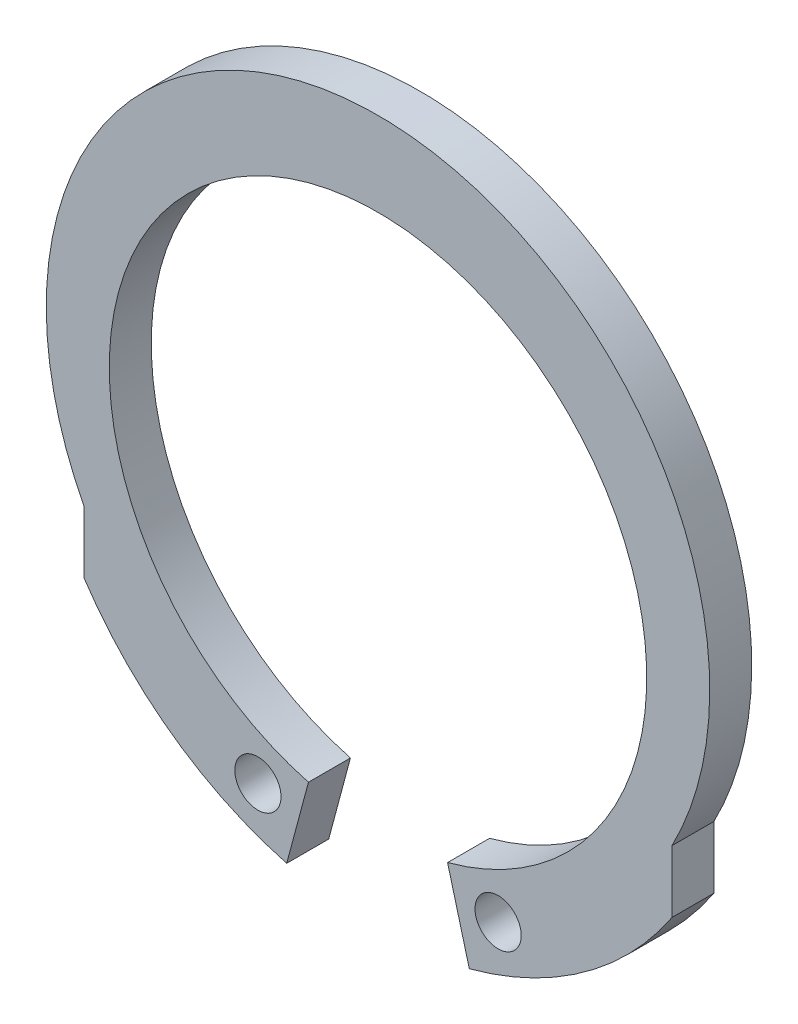
ISO-10303-21;
HEADER;
FILE_DESCRIPTION(('STEP AP214'),'2;1');
FILE_NAME('part.step','',(''),(''),'','','');
FILE_SCHEMA(('AUTOMOTIVE_DESIGN { 1 0 10303 214 1 1 1 1 }'));
ENDSEC;
DATA;
#1=APPLICATION_CONTEXT('core data for automotive mechanical design processes');
#2=APPLICATION_PROTOCOL_DEFINITION('international standard','automotive_design',2000,#1);
#3=PRODUCT_CONTEXT('',#1,'mechanical');
#4=PRODUCT('Part','Part','',(#3));
#5=PRODUCT_RELATED_PRODUCT_CATEGORY('part','',(#4));
#6=PRODUCT_DEFINITION_FORMATION('','',#4);
#7=PRODUCT_DEFINITION_CONTEXT('part definition',#1,'design');
#8=PRODUCT_DEFINITION('design','',#6,#7);
#9=PRODUCT_DEFINITION_SHAPE('','',#8);
#10=(LENGTH_UNIT() NAMED_UNIT(*) SI_UNIT(.MILLI.,.METRE.));
#11=(NAMED_UNIT(*) PLANE_ANGLE_UNIT() SI_UNIT($,.RADIAN.));
#12=(NAMED_UNIT(*) SI_UNIT($,.STERADIAN.) SOLID_ANGLE_UNIT());
#13=UNCERTAINTY_MEASURE_WITH_UNIT(LENGTH_MEASURE(1.E-05),#10,'distance_accuracy_value','');
#14=(GEOMETRIC_REPRESENTATION_CONTEXT(3) GLOBAL_UNCERTAINTY_ASSIGNED_CONTEXT((#13)) GLOBAL_UNIT_ASSIGNED_CONTEXT((#10,
#11,#12)) REPRESENTATION_CONTEXT('',''));
#15=CARTESIAN_POINT('',(0.,0.,0.));
#16=DIRECTION('',(0.,0.,1.));
#17=DIRECTION('',(1.,0.,0.));
#18=AXIS2_PLACEMENT_3D('',#15,#16,#17);
#19=CARTESIAN_POINT('',(0.,0.,1.));
#20=DIRECTION('',(0.,0.,1.));
#21=DIRECTION('',(1.,0.,0.));
#22=AXIS2_PLACEMENT_3D('',#19,#20,#21);
#23=PLANE('',#22);
#24=CARTESIAN_POINT('',(-2.86,-6.80996200449092,1.));
#25=DIRECTION('',(0.,0.,1.));
#26=DIRECTION('',(1.,0.,0.));
#27=AXIS2_PLACEMENT_3D('',#24,#25,#26);
#28=CIRCLE('',#27,0.55);
#29=CARTESIAN_POINT('',(-2.31,-6.80996200449092,1.));
#30=VERTEX_POINT('',#29);
#31=EDGE_CURVE('E131',#30,#30,#28,.T.);
#32=ORIENTED_EDGE('',*,*,#31,.F.);
#33=EDGE_LOOP('',(#32));
#34=FACE_BOUND('',#33,.T.);
#35=CARTESIAN_POINT('',(0.,0.,1.));
#36=DIRECTION('',(0.,0.,1.));
#37=DIRECTION('',(1.,0.,0.));
#38=AXIS2_PLACEMENT_3D('',#35,#36,#37);
#39=CIRCLE('',#38,8.4);
#40=CARTESIAN_POINT('',(-7.,-4.64327470649756,1.));
#41=VERTEX_POINT('',#40);
#42=CARTESIAN_POINT('',(-2.17407997886112,-8.11377694082819,1.));
#43=VERTEX_POINT('',#42);
#44=EDGE_CURVE('E142',#41,#43,#39,.T.);
#45=ORIENTED_EDGE('',*,*,#44,.T.);
#46=DIRECTION('',(0.258819045102514,0.96592582628907,0.));
#47=VECTOR('',#46,1.);
#48=CARTESIAN_POINT('',(-2.17407997886112,-8.11377694082819,1.));
#49=LINE('',#48,#47);
#50=CARTESIAN_POINT('',(-1.65644188865609,-6.18192528825005,1.));
#51=VERTEX_POINT('',#50);
#52=EDGE_CURVE('E90',#43,#51,#49,.T.);
#53=ORIENTED_EDGE('',*,*,#52,.T.);
#54=CARTESIAN_POINT('',(0.,0.,1.));
#55=DIRECTION('',(0.,0.,-1.));
#56=DIRECTION('',(1.,0.,0.));
#57=AXIS2_PLACEMENT_3D('',#54,#55,#56);
#58=CIRCLE('',#57,6.4);
#59=CARTESIAN_POINT('',(1.65644188865614,-6.18192528825004,1.));
#60=VERTEX_POINT('',#59);
#61=EDGE_CURVE('E157',#51,#60,#58,.T.);
#62=ORIENTED_EDGE('',*,*,#61,.T.);
#63=DIRECTION('',(0.258819045102522,-0.965925826289068,0.));
#64=VECTOR('',#63,1.);
#65=CARTESIAN_POINT('',(1.65644188865614,-6.18192528825004,1.));
#66=LINE('',#65,#64);
#67=CARTESIAN_POINT('',(2.17407997886118,-8.11377694082817,1.));
#68=VERTEX_POINT('',#67);
#69=EDGE_CURVE('E170',#60,#68,#66,.T.);
#70=ORIENTED_EDGE('',*,*,#69,.T.);
#71=CARTESIAN_POINT('',(0.,0.,1.));
#72=DIRECTION('',(0.,0.,1.));
#73=DIRECTION('',(1.,0.,0.));
#74=AXIS2_PLACEMENT_3D('',#71,#72,#73);
#75=CIRCLE('',#74,8.4);
#76=CARTESIAN_POINT('',(7.,-4.64327470649756,1.));
#77=VERTEX_POINT('',#76);
#78=EDGE_CURVE('E109',#68,#77,#75,.T.);
#79=ORIENTED_EDGE('',*,*,#78,.T.);
#80=DIRECTION('',(0.,1.,0.));
#81=VECTOR('',#80,1.);
#82=CARTESIAN_POINT('',(7.,-4.64327470649756,1.));
#83=LINE('',#82,#81);
#84=CARTESIAN_POINT('',(7.,-3.16196668472011,1.));
#85=VERTEX_POINT('',#84);
#86=EDGE_CURVE('E103',#77,#85,#83,.T.);
#87=ORIENTED_EDGE('',*,*,#86,.T.);
#88=CARTESIAN_POINT('',(0.,0.5,1.));
#89=DIRECTION('',(0.,0.,1.));
#90=DIRECTION('',(1.,0.,0.));
#91=AXIS2_PLACEMENT_3D('',#88,#89,#90);
#92=CIRCLE('',#91,7.9);
#93=CARTESIAN_POINT('',(-7.,-3.16196668472011,1.));
#94=VERTEX_POINT('',#93);
#95=EDGE_CURVE('E107',#85,#94,#92,.T.);
#96=ORIENTED_EDGE('',*,*,#95,.T.);
#97=DIRECTION('',(0.,-1.,0.));
#98=VECTOR('',#97,1.);
#99=CARTESIAN_POINT('',(-7.,-4.64327470649756,1.));
#100=LINE('',#99,#98);
#101=EDGE_CURVE('E47',#94,#41,#100,.T.);
#102=ORIENTED_EDGE('',*,*,#101,.T.);
#103=EDGE_LOOP('',(#45,#53,#62,#70,#79,#87,#96,#102));
#104=FACE_BOUND('',#103,.T.);
#105=CARTESIAN_POINT('',(2.86,-6.80996200449092,1.));
#106=DIRECTION('',(0.,0.,1.));
#107=DIRECTION('',(-1.,0.,0.));
#108=AXIS2_PLACEMENT_3D('',#105,#106,#107);
#109=CIRCLE('',#108,0.55);
#110=CARTESIAN_POINT('',(2.31,-6.80996200449092,1.));
#111=VERTEX_POINT('',#110);
#112=EDGE_CURVE('E179',#111,#111,#109,.T.);
#113=ORIENTED_EDGE('',*,*,#112,.F.);
#114=EDGE_LOOP('',(#113));
#115=FACE_BOUND('',#114,.T.);
#116=ADVANCED_FACE('F30',(#34,#104,#115),#23,.T.);
#117=CARTESIAN_POINT('',(0.,0.,0.));
#118=DIRECTION('',(0.,0.,1.));
#119=DIRECTION('',(1.,0.,0.));
#120=AXIS2_PLACEMENT_3D('',#117,#118,#119);
#121=PLANE('',#120);
#122=CARTESIAN_POINT('',(-2.86,-6.80996200449092,0.));
#123=DIRECTION('',(0.,0.,1.));
#124=DIRECTION('',(1.,0.,0.));
#125=AXIS2_PLACEMENT_3D('',#122,#123,#124);
#126=CIRCLE('',#125,0.55);
#127=CARTESIAN_POINT('',(-2.31,-6.80996200449092,0.));
#128=VERTEX_POINT('',#127);
#129=EDGE_CURVE('E176',#128,#128,#126,.T.);
#130=ORIENTED_EDGE('',*,*,#129,.T.);
#131=EDGE_LOOP('',(#130));
#132=FACE_BOUND('',#131,.T.);
#133=CARTESIAN_POINT('',(0.,0.,0.));
#134=DIRECTION('',(0.,0.,1.));
#135=DIRECTION('',(1.,0.,0.));
#136=AXIS2_PLACEMENT_3D('',#133,#134,#135);
#137=CIRCLE('',#136,8.4);
#138=CARTESIAN_POINT('',(-7.,-4.64327470649756,0.));
#139=VERTEX_POINT('',#138);
#140=CARTESIAN_POINT('',(-2.17407997886112,-8.11377694082819,0.));
#141=VERTEX_POINT('',#140);
#142=EDGE_CURVE('E127',#139,#141,#137,.T.);
#143=ORIENTED_EDGE('',*,*,#142,.F.);
#144=DIRECTION('',(0.,-1.,0.));
#145=VECTOR('',#144,1.);
#146=CARTESIAN_POINT('',(-7.,-4.64327470649756,0.));
#147=LINE('',#146,#145);
#148=CARTESIAN_POINT('',(-7.,-3.16196668472011,0.));
#149=VERTEX_POINT('',#148);
#150=EDGE_CURVE('E82',#149,#139,#147,.T.);
#151=ORIENTED_EDGE('',*,*,#150,.F.);
#152=CARTESIAN_POINT('',(0.,0.5,0.));
#153=DIRECTION('',(0.,0.,1.));
#154=DIRECTION('',(1.,0.,0.));
#155=AXIS2_PLACEMENT_3D('',#152,#153,#154);
#156=CIRCLE('',#155,7.9);
#157=CARTESIAN_POINT('',(7.,-3.16196668472011,0.));
#158=VERTEX_POINT('',#157);
#159=EDGE_CURVE('E76',#158,#149,#156,.T.);
#160=ORIENTED_EDGE('',*,*,#159,.F.);
#161=DIRECTION('',(0.,1.,0.));
#162=VECTOR('',#161,1.);
#163=CARTESIAN_POINT('',(7.,-4.64327470649756,0.));
#164=LINE('',#163,#162);
#165=CARTESIAN_POINT('',(7.,-4.64327470649756,0.));
#166=VERTEX_POINT('',#165);
#167=EDGE_CURVE('E117',#166,#158,#164,.T.);
#168=ORIENTED_EDGE('',*,*,#167,.F.);
#169=CARTESIAN_POINT('',(0.,0.,0.));
#170=DIRECTION('',(0.,0.,1.));
#171=DIRECTION('',(1.,0.,0.));
#172=AXIS2_PLACEMENT_3D('',#169,#170,#171);
#173=CIRCLE('',#172,8.4);
#174=CARTESIAN_POINT('',(2.17407997886118,-8.11377694082817,0.));
#175=VERTEX_POINT('',#174);
#176=EDGE_CURVE('E137',#175,#166,#173,.T.);
#177=ORIENTED_EDGE('',*,*,#176,.F.);
#178=DIRECTION('',(0.258819045102522,-0.965925826289068,0.));
#179=VECTOR('',#178,1.);
#180=CARTESIAN_POINT('',(1.65644188865614,-6.18192528825004,0.));
#181=LINE('',#180,#179);
#182=CARTESIAN_POINT('',(1.65644188865614,-6.18192528825004,0.));
#183=VERTEX_POINT('',#182);
#184=EDGE_CURVE('E135',#183,#175,#181,.T.);
#185=ORIENTED_EDGE('',*,*,#184,.F.);
#186=CARTESIAN_POINT('',(0.,0.,0.));
#187=DIRECTION('',(0.,0.,-1.));
#188=DIRECTION('',(1.,0.,0.));
#189=AXIS2_PLACEMENT_3D('',#186,#187,#188);
#190=CIRCLE('',#189,6.4);
#191=CARTESIAN_POINT('',(-1.65644188865609,-6.18192528825005,0.));
#192=VERTEX_POINT('',#191);
#193=EDGE_CURVE('E133',#192,#183,#190,.T.);
#194=ORIENTED_EDGE('',*,*,#193,.F.);
#195=DIRECTION('',(0.258819045102514,0.96592582628907,0.));
#196=VECTOR('',#195,1.);
#197=CARTESIAN_POINT('',(-2.17407997886112,-8.11377694082819,0.));
#198=LINE('',#197,#196);
#199=EDGE_CURVE('E130',#141,#192,#198,.T.);
#200=ORIENTED_EDGE('',*,*,#199,.F.);
#201=EDGE_LOOP('',(#143,#151,#160,#168,#177,#185,#194,#200));
#202=FACE_BOUND('',#201,.T.);
#203=CARTESIAN_POINT('',(2.86,-6.80996200449092,0.));
#204=DIRECTION('',(0.,0.,1.));
#205=DIRECTION('',(-1.,0.,0.));
#206=AXIS2_PLACEMENT_3D('',#203,#204,#205);
#207=CIRCLE('',#206,0.55);
#208=CARTESIAN_POINT('',(2.31,-6.80996200449092,0.));
#209=VERTEX_POINT('',#208);
#210=EDGE_CURVE('E182',#209,#209,#207,.T.);
#211=ORIENTED_EDGE('',*,*,#210,.T.);
#212=EDGE_LOOP('',(#211));
#213=FACE_BOUND('',#212,.T.);
#214=ADVANCED_FACE('F161',(#132,#202,#213),#121,.F.);
#215=CARTESIAN_POINT('',(0.,0.,1.));
#216=DIRECTION('',(0.,0.,-1.));
#217=DIRECTION('',(-1.,0.,0.));
#218=AXIS2_PLACEMENT_3D('',#215,#216,#217);
#219=CYLINDRICAL_SURFACE('',#218,8.4);
#220=ORIENTED_EDGE('',*,*,#142,.T.);
#221=DIRECTION('',(0.,0.,-1.));
#222=VECTOR('',#221,1.);
#223=CARTESIAN_POINT('',(-2.17407997886112,-8.11377694082819,1.));
#224=LINE('',#223,#222);
#225=EDGE_CURVE('E11',#43,#141,#224,.T.);
#226=ORIENTED_EDGE('',*,*,#225,.F.);
#227=ORIENTED_EDGE('',*,*,#44,.F.);
#228=DIRECTION('',(0.,0.,-1.));
#229=VECTOR('',#228,1.);
#230=CARTESIAN_POINT('',(-7.,-4.64327470649756,1.));
#231=LINE('',#230,#229);
#232=EDGE_CURVE('E123',#41,#139,#231,.T.);
#233=ORIENTED_EDGE('',*,*,#232,.T.);
#234=EDGE_LOOP('',(#220,#226,#227,#233));
#235=FACE_BOUND('',#234,.T.);
#236=ADVANCED_FACE('F32',(#235),#219,.T.);
#237=CARTESIAN_POINT('',(-2.17407997886112,-8.11377694082819,1.));
#238=DIRECTION('',(-0.96592582628907,0.258819045102514,0.));
#239=DIRECTION('',(-0.258819045102514,-0.96592582628907,0.));
#240=AXIS2_PLACEMENT_3D('',#237,#238,#239);
#241=PLANE('',#240);
#242=ORIENTED_EDGE('',*,*,#199,.T.);
#243=DIRECTION('',(0.,0.,-1.));
#244=VECTOR('',#243,1.);
#245=CARTESIAN_POINT('',(-1.65644188865609,-6.18192528825005,1.));
#246=LINE('',#245,#244);
#247=EDGE_CURVE('E39',#51,#192,#246,.T.);
#248=ORIENTED_EDGE('',*,*,#247,.F.);
#249=ORIENTED_EDGE('',*,*,#52,.F.);
#250=ORIENTED_EDGE('',*,*,#225,.T.);
#251=EDGE_LOOP('',(#242,#248,#249,#250));
#252=FACE_BOUND('',#251,.T.);
#253=ADVANCED_FACE('F215',(#252),#241,.F.);
#254=CARTESIAN_POINT('',(0.,0.,1.));
#255=DIRECTION('',(0.,0.,-1.));
#256=DIRECTION('',(-1.,0.,0.));
#257=AXIS2_PLACEMENT_3D('',#254,#255,#256);
#258=CYLINDRICAL_SURFACE('',#257,6.4);
#259=ORIENTED_EDGE('',*,*,#193,.T.);
#260=DIRECTION('',(0.,0.,-1.));
#261=VECTOR('',#260,1.);
#262=CARTESIAN_POINT('',(1.65644188865614,-6.18192528825004,1.));
#263=LINE('',#262,#261);
#264=EDGE_CURVE('E149',#60,#183,#263,.T.);
#265=ORIENTED_EDGE('',*,*,#264,.F.);
#266=ORIENTED_EDGE('',*,*,#61,.F.);
#267=ORIENTED_EDGE('',*,*,#247,.T.);
#268=EDGE_LOOP('',(#259,#265,#266,#267));
#269=FACE_BOUND('',#268,.T.);
#270=ADVANCED_FACE('F155',(#269),#258,.F.);
#271=CARTESIAN_POINT('',(1.65644188865614,-6.18192528825004,1.));
#272=DIRECTION('',(0.965925826289068,0.258819045102522,0.));
#273=DIRECTION('',(-0.258819045102522,0.965925826289068,0.));
#274=AXIS2_PLACEMENT_3D('',#271,#272,#273);
#275=PLANE('',#274);
#276=ORIENTED_EDGE('',*,*,#184,.T.);
#277=DIRECTION('',(0.,0.,-1.));
#278=VECTOR('',#277,1.);
#279=CARTESIAN_POINT('',(2.17407997886118,-8.11377694082817,1.));
#280=LINE('',#279,#278);
#281=EDGE_CURVE('E146',#68,#175,#280,.T.);
#282=ORIENTED_EDGE('',*,*,#281,.F.);
#283=ORIENTED_EDGE('',*,*,#69,.F.);
#284=ORIENTED_EDGE('',*,*,#264,.T.);
#285=EDGE_LOOP('',(#276,#282,#283,#284));
#286=FACE_BOUND('',#285,.T.);
#287=ADVANCED_FACE('F166',(#286),#275,.F.);
#288=CARTESIAN_POINT('',(0.,0.,1.));
#289=DIRECTION('',(0.,0.,-1.));
#290=DIRECTION('',(-1.,0.,0.));
#291=AXIS2_PLACEMENT_3D('',#288,#289,#290);
#292=CYLINDRICAL_SURFACE('',#291,8.4);
#293=ORIENTED_EDGE('',*,*,#176,.T.);
#294=DIRECTION('',(0.,0.,-1.));
#295=VECTOR('',#294,1.);
#296=CARTESIAN_POINT('',(7.,-4.64327470649756,1.));
#297=LINE('',#296,#295);
#298=EDGE_CURVE('E118',#77,#166,#297,.T.);
#299=ORIENTED_EDGE('',*,*,#298,.F.);
#300=ORIENTED_EDGE('',*,*,#78,.F.);
#301=ORIENTED_EDGE('',*,*,#281,.T.);
#302=EDGE_LOOP('',(#293,#299,#300,#301));
#303=FACE_BOUND('',#302,.T.);
#304=ADVANCED_FACE('F169',(#303),#292,.T.);
#305=CARTESIAN_POINT('',(7.,-4.64327470649756,1.));
#306=DIRECTION('',(-1.,0.,0.));
#307=DIRECTION('',(0.,-1.,0.));
#308=AXIS2_PLACEMENT_3D('',#305,#306,#307);
#309=PLANE('',#308);
#310=ORIENTED_EDGE('',*,*,#167,.T.);
#311=DIRECTION('',(0.,0.,-1.));
#312=VECTOR('',#311,1.);
#313=CARTESIAN_POINT('',(7.,-3.16196668472011,1.));
#314=LINE('',#313,#312);
#315=EDGE_CURVE('E114',#85,#158,#314,.T.);
#316=ORIENTED_EDGE('',*,*,#315,.F.);
#317=ORIENTED_EDGE('',*,*,#86,.F.);
#318=ORIENTED_EDGE('',*,*,#298,.T.);
#319=EDGE_LOOP('',(#310,#316,#317,#318));
#320=FACE_BOUND('',#319,.T.);
#321=ADVANCED_FACE('F115',(#320),#309,.F.);
#322=CARTESIAN_POINT('',(0.,0.5,1.));
#323=DIRECTION('',(0.,0.,-1.));
#324=DIRECTION('',(-1.,0.,0.));
#325=AXIS2_PLACEMENT_3D('',#322,#323,#324);
#326=CYLINDRICAL_SURFACE('',#325,7.9);
#327=ORIENTED_EDGE('',*,*,#159,.T.);
#328=DIRECTION('',(0.,0.,-1.));
#329=VECTOR('',#328,1.);
#330=CARTESIAN_POINT('',(-7.,-3.16196668472011,1.));
#331=LINE('',#330,#329);
#332=EDGE_CURVE('E119',#94,#149,#331,.T.);
#333=ORIENTED_EDGE('',*,*,#332,.F.);
#334=ORIENTED_EDGE('',*,*,#95,.F.);
#335=ORIENTED_EDGE('',*,*,#315,.T.);
#336=EDGE_LOOP('',(#327,#333,#334,#335));
#337=FACE_BOUND('',#336,.T.);
#338=ADVANCED_FACE('F121',(#337),#326,.T.);
#339=CARTESIAN_POINT('',(-7.,-4.64327470649756,1.));
#340=DIRECTION('',(1.,0.,0.));
#341=DIRECTION('',(0.,0.,-1.));
#342=AXIS2_PLACEMENT_3D('',#339,#340,#341);
#343=PLANE('',#342);
#344=ORIENTED_EDGE('',*,*,#150,.T.);
#345=ORIENTED_EDGE('',*,*,#232,.F.);
#346=ORIENTED_EDGE('',*,*,#101,.F.);
#347=ORIENTED_EDGE('',*,*,#332,.T.);
#348=EDGE_LOOP('',(#344,#345,#346,#347));
#349=FACE_BOUND('',#348,.T.);
#350=ADVANCED_FACE('F203',(#349),#343,.F.);
#351=CARTESIAN_POINT('',(-2.86,-6.80996200449092,1.));
#352=DIRECTION('',(0.,0.,-1.));
#353=DIRECTION('',(-1.,0.,0.));
#354=AXIS2_PLACEMENT_3D('',#351,#352,#353);
#355=CYLINDRICAL_SURFACE('',#354,0.55);
#356=ORIENTED_EDGE('',*,*,#31,.T.);
#357=EDGE_LOOP('',(#356));
#358=FACE_BOUND('',#357,.T.);
#359=ORIENTED_EDGE('',*,*,#129,.F.);
#360=EDGE_LOOP('',(#359));
#361=FACE_BOUND('',#360,.T.);
#362=ADVANCED_FACE('F200',(#358,#361),#355,.F.);
#363=CARTESIAN_POINT('',(2.86,-6.80996200449092,1.));
#364=DIRECTION('',(0.,0.,-1.));
#365=DIRECTION('',(-1.,0.,0.));
#366=AXIS2_PLACEMENT_3D('',#363,#364,#365);
#367=CYLINDRICAL_SURFACE('',#366,0.55);
#368=ORIENTED_EDGE('',*,*,#112,.T.);
#369=EDGE_LOOP('',(#368));
#370=FACE_BOUND('',#369,.T.);
#371=ORIENTED_EDGE('',*,*,#210,.F.);
#372=EDGE_LOOP('',(#371));
#373=FACE_BOUND('',#372,.T.);
#374=ADVANCED_FACE('F188',(#370,#373),#367,.F.);
#375=CLOSED_SHELL('',(#116,#214,#236,#253,#270,#287,#304,#321,#338,#350,#362,#374));
#376=MANIFOLD_SOLID_BREP('B2',#375);
#377=ADVANCED_BREP_SHAPE_REPRESENTATION('',(#18,#376),#14);
#378=SHAPE_DEFINITION_REPRESENTATION(#9,#377);
ENDSEC;
END-ISO-10303-21;
